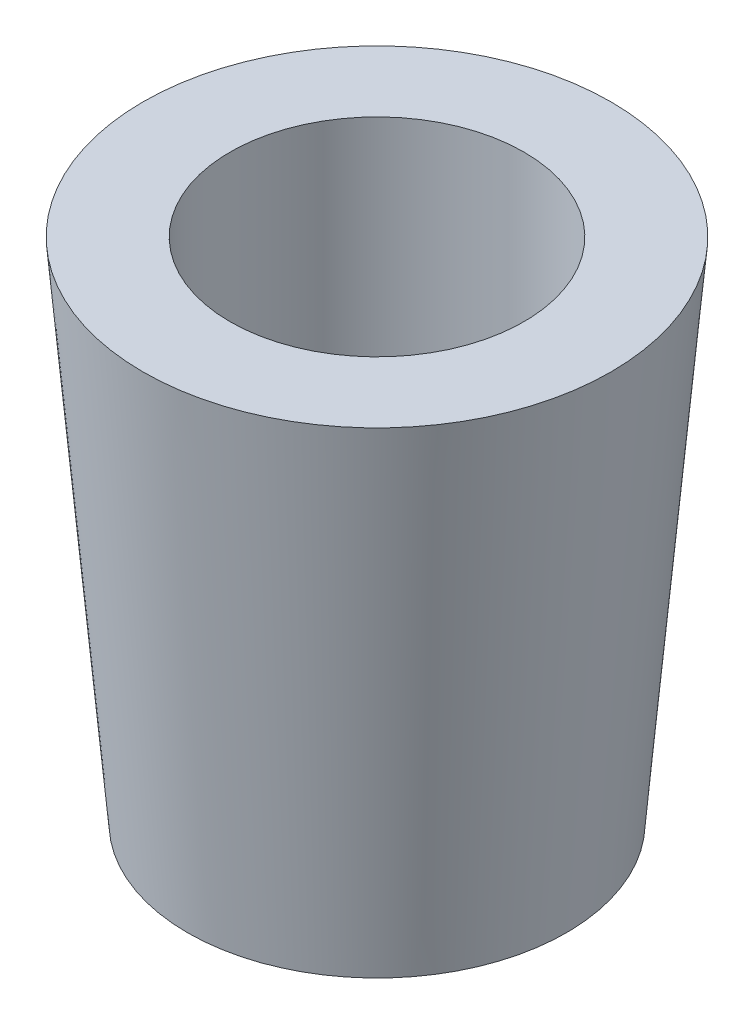
ISO-10303-21;
HEADER;
FILE_DESCRIPTION(('STEP AP214'),'2;1');
FILE_NAME('part.step','',(''),(''),'','','');
FILE_SCHEMA(('AUTOMOTIVE_DESIGN { 1 0 10303 214 1 1 1 1 }'));
ENDSEC;
DATA;
#1=APPLICATION_CONTEXT('core data for automotive mechanical design processes');
#2=APPLICATION_PROTOCOL_DEFINITION('international standard','automotive_design',2000,#1);
#3=PRODUCT_CONTEXT('',#1,'mechanical');
#4=PRODUCT('Part','Part','',(#3));
#5=PRODUCT_RELATED_PRODUCT_CATEGORY('part','',(#4));
#6=PRODUCT_DEFINITION_FORMATION('','',#4);
#7=PRODUCT_DEFINITION_CONTEXT('part definition',#1,'design');
#8=PRODUCT_DEFINITION('design','',#6,#7);
#9=PRODUCT_DEFINITION_SHAPE('','',#8);
#10=(LENGTH_UNIT() NAMED_UNIT(*) SI_UNIT(.MILLI.,.METRE.));
#11=(NAMED_UNIT(*) PLANE_ANGLE_UNIT() SI_UNIT($,.RADIAN.));
#12=(NAMED_UNIT(*) SI_UNIT($,.STERADIAN.) SOLID_ANGLE_UNIT());
#13=UNCERTAINTY_MEASURE_WITH_UNIT(LENGTH_MEASURE(1.E-05),#10,'distance_accuracy_value','');
#14=(GEOMETRIC_REPRESENTATION_CONTEXT(3) GLOBAL_UNCERTAINTY_ASSIGNED_CONTEXT((#13)) GLOBAL_UNIT_ASSIGNED_CONTEXT((#10,
#11,#12)) REPRESENTATION_CONTEXT('',''));
#15=CARTESIAN_POINT('',(0.,0.,0.));
#16=DIRECTION('',(0.,0.,1.));
#17=DIRECTION('',(1.,0.,0.));
#18=AXIS2_PLACEMENT_3D('',#15,#16,#17);
#19=CARTESIAN_POINT('',(0.,-25.4,0.));
#20=DIRECTION('',(0.,1.,0.));
#21=DIRECTION('',(0.,0.,1.));
#22=AXIS2_PLACEMENT_3D('',#19,#20,#21);
#23=CYLINDRICAL_SURFACE('',#22,3.175);
#24=CARTESIAN_POINT('',(0.,-25.4,0.));
#25=DIRECTION('',(0.,1.,0.));
#26=DIRECTION('',(0.,0.,1.));
#27=AXIS2_PLACEMENT_3D('',#24,#25,#26);
#28=CIRCLE('',#27,3.175);
#29=CARTESIAN_POINT('',(0.,-25.4,3.175));
#30=VERTEX_POINT('',#29);
#31=EDGE_CURVE('E43',#30,#30,#28,.T.);
#32=ORIENTED_EDGE('',*,*,#31,.F.);
#33=EDGE_LOOP('',(#32));
#34=FACE_BOUND('',#33,.T.);
#35=CARTESIAN_POINT('',(0.,-12.7,0.));
#36=DIRECTION('',(0.,1.,0.));
#37=DIRECTION('',(0.,0.,1.));
#38=AXIS2_PLACEMENT_3D('',#35,#36,#37);
#39=CIRCLE('',#38,3.175);
#40=CARTESIAN_POINT('',(0.,-12.7,3.175));
#41=VERTEX_POINT('',#40);
#42=EDGE_CURVE('E35',#41,#41,#39,.F.);
#43=ORIENTED_EDGE('',*,*,#42,.F.);
#44=EDGE_LOOP('',(#43));
#45=FACE_BOUND('',#44,.T.);
#46=ADVANCED_FACE('F31',(#34,#45),#23,.F.);
#47=CARTESIAN_POINT('',(0.,0.,0.));
#48=DIRECTION('',(0.,1.,0.));
#49=DIRECTION('',(0.,0.,1.));
#50=AXIS2_PLACEMENT_3D('',#47,#48,#49);
#51=CONICAL_SURFACE('',#50,11.7,0.0872664625997167);
#52=CARTESIAN_POINT('',(0.,-25.4,0.));
#53=DIRECTION('',(0.,1.,0.));
#54=DIRECTION('',(0.,0.,1.));
#55=AXIS2_PLACEMENT_3D('',#52,#53,#54);
#56=CIRCLE('',#55,9.47778794644153);
#57=CARTESIAN_POINT('',(0.,-25.4,9.47778794644153));
#58=VERTEX_POINT('',#57);
#59=EDGE_CURVE('E10',#58,#58,#56,.T.);
#60=ORIENTED_EDGE('',*,*,#59,.T.);
#61=EDGE_LOOP('',(#60));
#62=FACE_BOUND('',#61,.T.);
#63=CARTESIAN_POINT('',(0.,0.,0.));
#64=DIRECTION('',(0.,1.,0.));
#65=DIRECTION('',(0.,0.,1.));
#66=AXIS2_PLACEMENT_3D('',#63,#64,#65);
#67=CIRCLE('',#66,11.7);
#68=CARTESIAN_POINT('',(0.,0.,11.7));
#69=VERTEX_POINT('',#68);
#70=EDGE_CURVE('E39',#69,#69,#67,.T.);
#71=ORIENTED_EDGE('',*,*,#70,.F.);
#72=EDGE_LOOP('',(#71));
#73=FACE_BOUND('',#72,.T.);
#74=ADVANCED_FACE('F33',(#62,#73),#51,.T.);
#75=CARTESIAN_POINT('',(0.,-25.4,0.));
#76=DIRECTION('',(0.,1.,0.));
#77=DIRECTION('',(0.,0.,1.));
#78=AXIS2_PLACEMENT_3D('',#75,#76,#77);
#79=PLANE('',#78);
#80=ORIENTED_EDGE('',*,*,#31,.T.);
#81=EDGE_LOOP('',(#80));
#82=FACE_BOUND('',#81,.T.);
#83=ORIENTED_EDGE('',*,*,#59,.F.);
#84=EDGE_LOOP('',(#83));
#85=FACE_BOUND('',#84,.T.);
#86=ADVANCED_FACE('F66',(#82,#85),#79,.F.);
#87=CARTESIAN_POINT('',(0.,0.,0.));
#88=DIRECTION('',(0.,1.,0.));
#89=DIRECTION('',(0.,0.,1.));
#90=AXIS2_PLACEMENT_3D('',#87,#88,#89);
#91=PLANE('',#90);
#92=CARTESIAN_POINT('',(0.,0.,0.));
#93=DIRECTION('',(0.,1.,0.));
#94=DIRECTION('',(0.,0.,1.));
#95=AXIS2_PLACEMENT_3D('',#92,#93,#94);
#96=CIRCLE('',#95,7.35);
#97=CARTESIAN_POINT('',(0.,0.,7.35));
#98=VERTEX_POINT('',#97);
#99=EDGE_CURVE('E48',#98,#98,#96,.T.);
#100=ORIENTED_EDGE('',*,*,#99,.F.);
#101=EDGE_LOOP('',(#100));
#102=FACE_BOUND('',#101,.T.);
#103=ORIENTED_EDGE('',*,*,#70,.T.);
#104=EDGE_LOOP('',(#103));
#105=FACE_BOUND('',#104,.T.);
#106=ADVANCED_FACE('F73',(#102,#105),#91,.T.);
#107=CARTESIAN_POINT('',(0.,-12.7,0.));
#108=DIRECTION('',(0.,1.,0.));
#109=DIRECTION('',(0.,0.,1.));
#110=AXIS2_PLACEMENT_3D('',#107,#108,#109);
#111=PLANE('',#110);
#112=CARTESIAN_POINT('',(0.,-12.7,0.));
#113=DIRECTION('',(0.,1.,0.));
#114=DIRECTION('',(0.,0.,1.));
#115=AXIS2_PLACEMENT_3D('',#112,#113,#114);
#116=CIRCLE('',#115,7.35);
#117=CARTESIAN_POINT('',(0.,-12.7,7.35));
#118=VERTEX_POINT('',#117);
#119=EDGE_CURVE('E51',#118,#118,#116,.T.);
#120=ORIENTED_EDGE('',*,*,#119,.T.);
#121=EDGE_LOOP('',(#120));
#122=FACE_BOUND('',#121,.T.);
#123=ORIENTED_EDGE('',*,*,#42,.T.);
#124=EDGE_LOOP('',(#123));
#125=FACE_BOUND('',#124,.T.);
#126=ADVANCED_FACE('F58',(#122,#125),#111,.T.);
#127=CARTESIAN_POINT('',(0.,-12.7,0.));
#128=DIRECTION('',(0.,1.,0.));
#129=DIRECTION('',(0.,0.,1.));
#130=AXIS2_PLACEMENT_3D('',#127,#128,#129);
#131=CYLINDRICAL_SURFACE('',#130,7.35);
#132=ORIENTED_EDGE('',*,*,#119,.F.);
#133=EDGE_LOOP('',(#132));
#134=FACE_BOUND('',#133,.T.);
#135=ORIENTED_EDGE('',*,*,#99,.T.);
#136=EDGE_LOOP('',(#135));
#137=FACE_BOUND('',#136,.T.);
#138=ADVANCED_FACE('F70',(#134,#137),#131,.F.);
#139=CLOSED_SHELL('',(#46,#74,#86,#106,#126,#138));
#140=MANIFOLD_SOLID_BREP('B2',#139);
#141=ADVANCED_BREP_SHAPE_REPRESENTATION('',(#18,#140),#14);
#142=SHAPE_DEFINITION_REPRESENTATION(#9,#141);
ENDSEC;
END-ISO-10303-21;
